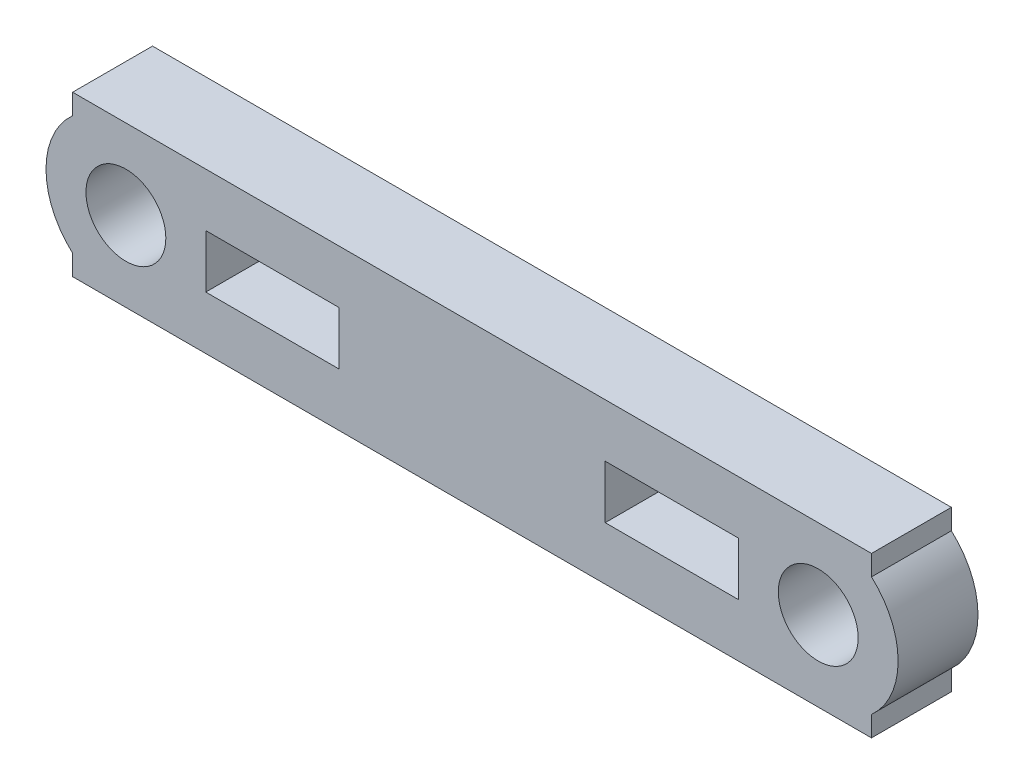
ISO-10303-21;
HEADER;
FILE_DESCRIPTION(('STEP AP214'),'2;1');
FILE_NAME('part.step','',(''),(''),'','','');
FILE_SCHEMA(('AUTOMOTIVE_DESIGN { 1 0 10303 214 1 1 1 1 }'));
ENDSEC;
DATA;
#1=APPLICATION_CONTEXT('core data for automotive mechanical design processes');
#2=APPLICATION_PROTOCOL_DEFINITION('international standard','automotive_design',2000,#1);
#3=PRODUCT_CONTEXT('',#1,'mechanical');
#4=PRODUCT('Part','Part','',(#3));
#5=PRODUCT_RELATED_PRODUCT_CATEGORY('part','',(#4));
#6=PRODUCT_DEFINITION_FORMATION('','',#4);
#7=PRODUCT_DEFINITION_CONTEXT('part definition',#1,'design');
#8=PRODUCT_DEFINITION('design','',#6,#7);
#9=PRODUCT_DEFINITION_SHAPE('','',#8);
#10=(LENGTH_UNIT() NAMED_UNIT(*) SI_UNIT(.MILLI.,.METRE.));
#11=(NAMED_UNIT(*) PLANE_ANGLE_UNIT() SI_UNIT($,.RADIAN.));
#12=(NAMED_UNIT(*) SI_UNIT($,.STERADIAN.) SOLID_ANGLE_UNIT());
#13=UNCERTAINTY_MEASURE_WITH_UNIT(LENGTH_MEASURE(1.E-05),#10,'distance_accuracy_value','');
#14=(GEOMETRIC_REPRESENTATION_CONTEXT(3) GLOBAL_UNCERTAINTY_ASSIGNED_CONTEXT((#13)) GLOBAL_UNIT_ASSIGNED_CONTEXT((#10,
#11,#12)) REPRESENTATION_CONTEXT('',''));
#15=CARTESIAN_POINT('',(0.,0.,0.));
#16=DIRECTION('',(0.,0.,1.));
#17=DIRECTION('',(1.,0.,0.));
#18=AXIS2_PLACEMENT_3D('',#15,#16,#17);
#19=CARTESIAN_POINT('',(-83.5597473967523,29.0911389026961,3.));
#20=DIRECTION('',(1.,0.,0.));
#21=DIRECTION('',(0.,0.,-1.));
#22=AXIS2_PLACEMENT_3D('',#19,#20,#21);
#23=PLANE('',#22);
#24=DIRECTION('',(0.,-1.,0.));
#25=VECTOR('',#24,1.);
#26=CARTESIAN_POINT('',(-83.5597473967523,29.0911389026961,0.));
#27=LINE('',#26,#25);
#28=CARTESIAN_POINT('',(-83.5597473967523,29.0911389026961,0.));
#29=VERTEX_POINT('',#28);
#30=CARTESIAN_POINT('',(-83.5597473967523,28.3272068801959,0.));
#31=VERTEX_POINT('',#30);
#32=EDGE_CURVE('E160',#29,#31,#27,.T.);
#33=ORIENTED_EDGE('',*,*,#32,.T.);
#34=DIRECTION('',(0.,0.,1.));
#35=VECTOR('',#34,1.);
#36=CARTESIAN_POINT('',(-83.5597473967523,28.3272068801959,0.));
#37=LINE('',#36,#35);
#38=CARTESIAN_POINT('',(-83.5597473967523,28.3272068801959,3.));
#39=VERTEX_POINT('',#38);
#40=EDGE_CURVE('E144',#31,#39,#37,.T.);
#41=ORIENTED_EDGE('',*,*,#40,.T.);
#42=DIRECTION('',(0.,-1.,0.));
#43=VECTOR('',#42,1.);
#44=CARTESIAN_POINT('',(-83.5597473967523,29.0911389026961,3.));
#45=LINE('',#44,#43);
#46=CARTESIAN_POINT('',(-83.5597473967523,29.0911389026961,3.));
#47=VERTEX_POINT('',#46);
#48=EDGE_CURVE('E277',#47,#39,#45,.T.);
#49=ORIENTED_EDGE('',*,*,#48,.F.);
#50=DIRECTION('',(0.,0.,-1.));
#51=VECTOR('',#50,1.);
#52=CARTESIAN_POINT('',(-83.5597473967523,29.0911389026961,3.));
#53=LINE('',#52,#51);
#54=EDGE_CURVE('E166',#47,#29,#53,.T.);
#55=ORIENTED_EDGE('',*,*,#54,.T.);
#56=EDGE_LOOP('',(#33,#41,#49,#55));
#57=FACE_BOUND('',#56,.T.);
#58=ADVANCED_FACE('F33',(#57),#23,.F.);
#59=CARTESIAN_POINT('',(-53.5597473967523,29.0911389026961,3.));
#60=DIRECTION('',(-1.,0.,0.));
#61=DIRECTION('',(0.,0.,1.));
#62=AXIS2_PLACEMENT_3D('',#59,#60,#61);
#63=PLANE('',#62);
#64=DIRECTION('',(0.,1.,0.));
#65=VECTOR('',#64,1.);
#66=CARTESIAN_POINT('',(-53.5597473967523,29.0911389026961,0.));
#67=LINE('',#66,#65);
#68=CARTESIAN_POINT('',(-53.5597473967523,23.0911389026961,0.));
#69=VERTEX_POINT('',#68);
#70=CARTESIAN_POINT('',(-53.5597473967523,23.8550709251964,0.));
#71=VERTEX_POINT('',#70);
#72=EDGE_CURVE('E176',#69,#71,#67,.T.);
#73=ORIENTED_EDGE('',*,*,#72,.T.);
#74=DIRECTION('',(0.,0.,1.));
#75=VECTOR('',#74,1.);
#76=CARTESIAN_POINT('',(-53.5597473967523,23.8550709251964,0.));
#77=LINE('',#76,#75);
#78=CARTESIAN_POINT('',(-53.5597473967523,23.8550709251964,3.));
#79=VERTEX_POINT('',#78);
#80=EDGE_CURVE('E200',#71,#79,#77,.T.);
#81=ORIENTED_EDGE('',*,*,#80,.T.);
#82=DIRECTION('',(0.,1.,0.));
#83=VECTOR('',#82,1.);
#84=CARTESIAN_POINT('',(-53.5597473967523,29.0911389026961,3.));
#85=LINE('',#84,#83);
#86=CARTESIAN_POINT('',(-53.5597473967523,23.0911389026961,3.));
#87=VERTEX_POINT('',#86);
#88=EDGE_CURVE('E192',#87,#79,#85,.T.);
#89=ORIENTED_EDGE('',*,*,#88,.F.);
#90=DIRECTION('',(0.,0.,-1.));
#91=VECTOR('',#90,1.);
#92=CARTESIAN_POINT('',(-53.5597473967523,23.0911389026961,3.));
#93=LINE('',#92,#91);
#94=EDGE_CURVE('E41',#87,#69,#93,.T.);
#95=ORIENTED_EDGE('',*,*,#94,.T.);
#96=EDGE_LOOP('',(#73,#81,#89,#95));
#97=FACE_BOUND('',#96,.T.);
#98=ADVANCED_FACE('F190',(#97),#63,.F.);
#99=CARTESIAN_POINT('',(0.,0.,3.));
#100=DIRECTION('',(0.,0.,1.));
#101=DIRECTION('',(1.,0.,0.));
#102=AXIS2_PLACEMENT_3D('',#99,#100,#101);
#103=PLANE('',#102);
#104=CARTESIAN_POINT('',(-81.5597473967523,26.0911389026961,3.));
#105=DIRECTION('',(0.,0.,1.));
#106=DIRECTION('',(1.,0.,0.));
#107=AXIS2_PLACEMENT_3D('',#104,#105,#106);
#108=CIRCLE('',#107,1.5);
#109=CARTESIAN_POINT('',(-80.0597473967523,26.0911389026961,3.));
#110=VERTEX_POINT('',#109);
#111=EDGE_CURVE('E215',#110,#110,#108,.T.);
#112=ORIENTED_EDGE('',*,*,#111,.F.);
#113=EDGE_LOOP('',(#112));
#114=FACE_BOUND('',#113,.T.);
#115=DIRECTION('',(0.,1.,0.));
#116=VECTOR('',#115,1.);
#117=CARTESIAN_POINT('',(-73.5597473967523,27.0911389026961,3.));
#118=LINE('',#117,#116);
#119=CARTESIAN_POINT('',(-73.5597473967523,25.0911389026961,3.));
#120=VERTEX_POINT('',#119);
#121=CARTESIAN_POINT('',(-73.5597473967523,27.0911389026961,3.));
#122=VERTEX_POINT('',#121);
#123=EDGE_CURVE('E255',#120,#122,#118,.T.);
#124=ORIENTED_EDGE('',*,*,#123,.F.);
#125=DIRECTION('',(1.,0.,0.));
#126=VECTOR('',#125,1.);
#127=CARTESIAN_POINT('',(-73.5597473967523,25.0911389026961,3.));
#128=LINE('',#127,#126);
#129=CARTESIAN_POINT('',(-78.5597473967523,25.0911389026961,3.));
#130=VERTEX_POINT('',#129);
#131=EDGE_CURVE('E252',#130,#120,#128,.T.);
#132=ORIENTED_EDGE('',*,*,#131,.F.);
#133=DIRECTION('',(0.,-1.,0.));
#134=VECTOR('',#133,1.);
#135=CARTESIAN_POINT('',(-78.5597473967523,25.0911389026961,3.));
#136=LINE('',#135,#134);
#137=CARTESIAN_POINT('',(-78.5597473967523,27.0911389026961,3.));
#138=VERTEX_POINT('',#137);
#139=EDGE_CURVE('E250',#138,#130,#136,.T.);
#140=ORIENTED_EDGE('',*,*,#139,.F.);
#141=DIRECTION('',(-1.,0.,0.));
#142=VECTOR('',#141,1.);
#143=CARTESIAN_POINT('',(-78.5597473967523,27.0911389026961,3.));
#144=LINE('',#143,#142);
#145=EDGE_CURVE('E257',#122,#138,#144,.T.);
#146=ORIENTED_EDGE('',*,*,#145,.F.);
#147=EDGE_LOOP('',(#124,#132,#140,#146));
#148=FACE_BOUND('',#147,.T.);
#149=ORIENTED_EDGE('',*,*,#48,.T.);
#150=CARTESIAN_POINT('',(-81.5597473967523,26.0911389026961,3.));
#151=DIRECTION('',(0.,0.,1.));
#152=DIRECTION('',(1.,0.,0.));
#153=AXIS2_PLACEMENT_3D('',#150,#151,#152);
#154=CIRCLE('',#153,2.99999999999999);
#155=CARTESIAN_POINT('',(-83.5597473967523,23.8550709251964,3.));
#156=VERTEX_POINT('',#155);
#157=EDGE_CURVE('E48',#39,#156,#154,.T.);
#158=ORIENTED_EDGE('',*,*,#157,.T.);
#159=CARTESIAN_POINT('',(-83.5597473967523,23.0911389026961,3.));
#160=VERTEX_POINT('',#159);
#161=EDGE_CURVE('E181',#156,#160,#45,.T.);
#162=ORIENTED_EDGE('',*,*,#161,.T.);
#163=DIRECTION('',(1.,0.,0.));
#164=VECTOR('',#163,1.);
#165=CARTESIAN_POINT('',(-83.5597473967523,23.0911389026961,3.));
#166=LINE('',#165,#164);
#167=EDGE_CURVE('E279',#160,#87,#166,.T.);
#168=ORIENTED_EDGE('',*,*,#167,.T.);
#169=ORIENTED_EDGE('',*,*,#88,.T.);
#170=CARTESIAN_POINT('',(-55.5597473967523,26.0911389026961,3.));
#171=DIRECTION('',(0.,0.,1.));
#172=DIRECTION('',(1.,0.,0.));
#173=AXIS2_PLACEMENT_3D('',#170,#171,#172);
#174=CIRCLE('',#173,3.);
#175=CARTESIAN_POINT('',(-53.5597473967523,28.3272068801959,3.));
#176=VERTEX_POINT('',#175);
#177=EDGE_CURVE('E55',#79,#176,#174,.T.);
#178=ORIENTED_EDGE('',*,*,#177,.T.);
#179=CARTESIAN_POINT('',(-53.5597473967523,29.0911389026961,3.));
#180=VERTEX_POINT('',#179);
#181=EDGE_CURVE('E280',#176,#180,#85,.T.);
#182=ORIENTED_EDGE('',*,*,#181,.T.);
#183=DIRECTION('',(-1.,0.,0.));
#184=VECTOR('',#183,1.);
#185=CARTESIAN_POINT('',(-83.5597473967523,29.0911389026961,3.));
#186=LINE('',#185,#184);
#187=EDGE_CURVE('E173',#180,#47,#186,.T.);
#188=ORIENTED_EDGE('',*,*,#187,.T.);
#189=EDGE_LOOP('',(#149,#158,#162,#168,#169,#178,#182,#188));
#190=FACE_BOUND('',#189,.T.);
#191=DIRECTION('',(0.,-1.,0.));
#192=VECTOR('',#191,1.);
#193=CARTESIAN_POINT('',(-63.5597473967523,25.0911389026961,3.));
#194=LINE('',#193,#192);
#195=CARTESIAN_POINT('',(-63.5597473967523,27.0911389026961,3.));
#196=VERTEX_POINT('',#195);
#197=CARTESIAN_POINT('',(-63.5597473967523,25.0911389026961,3.));
#198=VERTEX_POINT('',#197);
#199=EDGE_CURVE('E226',#196,#198,#194,.T.);
#200=ORIENTED_EDGE('',*,*,#199,.F.);
#201=DIRECTION('',(-1.,0.,0.));
#202=VECTOR('',#201,1.);
#203=CARTESIAN_POINT('',(-63.5597473967523,27.0911389026961,3.));
#204=LINE('',#203,#202);
#205=CARTESIAN_POINT('',(-58.5597473967523,27.0911389026961,3.));
#206=VERTEX_POINT('',#205);
#207=EDGE_CURVE('E223',#206,#196,#204,.T.);
#208=ORIENTED_EDGE('',*,*,#207,.F.);
#209=DIRECTION('',(0.,1.,0.));
#210=VECTOR('',#209,1.);
#211=CARTESIAN_POINT('',(-58.5597473967523,27.0911389026961,3.));
#212=LINE('',#211,#210);
#213=CARTESIAN_POINT('',(-58.5597473967523,25.0911389026961,3.));
#214=VERTEX_POINT('',#213);
#215=EDGE_CURVE('E221',#214,#206,#212,.T.);
#216=ORIENTED_EDGE('',*,*,#215,.F.);
#217=DIRECTION('',(1.,0.,0.));
#218=VECTOR('',#217,1.);
#219=CARTESIAN_POINT('',(-58.5597473967523,25.0911389026961,3.));
#220=LINE('',#219,#218);
#221=EDGE_CURVE('E228',#198,#214,#220,.T.);
#222=ORIENTED_EDGE('',*,*,#221,.F.);
#223=EDGE_LOOP('',(#200,#208,#216,#222));
#224=FACE_BOUND('',#223,.T.);
#225=CARTESIAN_POINT('',(-55.5597473967523,26.0911389026961,3.));
#226=DIRECTION('',(0.,0.,1.));
#227=DIRECTION('',(1.,0.,0.));
#228=AXIS2_PLACEMENT_3D('',#225,#226,#227);
#229=CIRCLE('',#228,1.5);
#230=CARTESIAN_POINT('',(-54.0597473967523,26.0911389026961,3.));
#231=VERTEX_POINT('',#230);
#232=EDGE_CURVE('E209',#231,#231,#229,.T.);
#233=ORIENTED_EDGE('',*,*,#232,.F.);
#234=EDGE_LOOP('',(#233));
#235=FACE_BOUND('',#234,.T.);
#236=ADVANCED_FACE('F283',(#114,#148,#190,#224,#235),#103,.T.);
#237=CARTESIAN_POINT('',(0.,0.,0.));
#238=DIRECTION('',(0.,0.,1.));
#239=DIRECTION('',(1.,0.,0.));
#240=AXIS2_PLACEMENT_3D('',#237,#238,#239);
#241=PLANE('',#240);
#242=CARTESIAN_POINT('',(-81.5597473967523,26.0911389026961,0.));
#243=DIRECTION('',(0.,0.,1.));
#244=DIRECTION('',(1.,0.,0.));
#245=AXIS2_PLACEMENT_3D('',#242,#243,#244);
#246=CIRCLE('',#245,1.5);
#247=CARTESIAN_POINT('',(-80.0597473967523,26.0911389026961,0.));
#248=VERTEX_POINT('',#247);
#249=EDGE_CURVE('E212',#248,#248,#246,.T.);
#250=ORIENTED_EDGE('',*,*,#249,.T.);
#251=EDGE_LOOP('',(#250));
#252=FACE_BOUND('',#251,.T.);
#253=DIRECTION('',(1.,0.,0.));
#254=VECTOR('',#253,1.);
#255=CARTESIAN_POINT('',(-73.5597473967523,25.0911389026961,0.));
#256=LINE('',#255,#254);
#257=CARTESIAN_POINT('',(-78.5597473967523,25.0911389026961,0.));
#258=VERTEX_POINT('',#257);
#259=CARTESIAN_POINT('',(-73.5597473967523,25.0911389026961,0.));
#260=VERTEX_POINT('',#259);
#261=EDGE_CURVE('E249',#258,#260,#256,.T.);
#262=ORIENTED_EDGE('',*,*,#261,.T.);
#263=DIRECTION('',(0.,1.,0.));
#264=VECTOR('',#263,1.);
#265=CARTESIAN_POINT('',(-73.5597473967523,27.0911389026961,0.));
#266=LINE('',#265,#264);
#267=CARTESIAN_POINT('',(-73.5597473967523,27.0911389026961,0.));
#268=VERTEX_POINT('',#267);
#269=EDGE_CURVE('E263',#260,#268,#266,.T.);
#270=ORIENTED_EDGE('',*,*,#269,.T.);
#271=DIRECTION('',(-1.,0.,0.));
#272=VECTOR('',#271,1.);
#273=CARTESIAN_POINT('',(-78.5597473967523,27.0911389026961,0.));
#274=LINE('',#273,#272);
#275=CARTESIAN_POINT('',(-78.5597473967523,27.0911389026961,0.));
#276=VERTEX_POINT('',#275);
#277=EDGE_CURVE('E266',#268,#276,#274,.T.);
#278=ORIENTED_EDGE('',*,*,#277,.T.);
#279=DIRECTION('',(0.,-1.,0.));
#280=VECTOR('',#279,1.);
#281=CARTESIAN_POINT('',(-78.5597473967523,26.0911389026961,0.));
#282=LINE('',#281,#280);
#283=EDGE_CURVE('E253',#276,#258,#282,.T.);
#284=ORIENTED_EDGE('',*,*,#283,.T.);
#285=EDGE_LOOP('',(#262,#270,#278,#284));
#286=FACE_BOUND('',#285,.T.);
#287=ORIENTED_EDGE('',*,*,#32,.F.);
#288=DIRECTION('',(-1.,0.,0.));
#289=VECTOR('',#288,1.);
#290=CARTESIAN_POINT('',(-83.5597473967523,29.0911389026961,0.));
#291=LINE('',#290,#289);
#292=CARTESIAN_POINT('',(-53.5597473967523,29.0911389026961,0.));
#293=VERTEX_POINT('',#292);
#294=EDGE_CURVE('E179',#293,#29,#291,.T.);
#295=ORIENTED_EDGE('',*,*,#294,.F.);
#296=CARTESIAN_POINT('',(-53.5597473967523,28.3272068801959,0.));
#297=VERTEX_POINT('',#296);
#298=EDGE_CURVE('E169',#297,#293,#67,.T.);
#299=ORIENTED_EDGE('',*,*,#298,.F.);
#300=CARTESIAN_POINT('',(-55.5597473967523,26.0911389026961,0.));
#301=DIRECTION('',(0.,0.,1.));
#302=DIRECTION('',(1.,0.,0.));
#303=AXIS2_PLACEMENT_3D('',#300,#301,#302);
#304=CIRCLE('',#303,3.);
#305=EDGE_CURVE('E197',#71,#297,#304,.T.);
#306=ORIENTED_EDGE('',*,*,#305,.F.);
#307=ORIENTED_EDGE('',*,*,#72,.F.);
#308=DIRECTION('',(1.,0.,0.));
#309=VECTOR('',#308,1.);
#310=CARTESIAN_POINT('',(-83.5597473967523,23.0911389026961,0.));
#311=LINE('',#310,#309);
#312=CARTESIAN_POINT('',(-83.5597473967523,23.0911389026961,0.));
#313=VERTEX_POINT('',#312);
#314=EDGE_CURVE('E167',#313,#69,#311,.T.);
#315=ORIENTED_EDGE('',*,*,#314,.F.);
#316=CARTESIAN_POINT('',(-83.5597473967523,23.8550709251964,0.));
#317=VERTEX_POINT('',#316);
#318=EDGE_CURVE('E162',#317,#313,#27,.T.);
#319=ORIENTED_EDGE('',*,*,#318,.F.);
#320=CARTESIAN_POINT('',(-81.5597473967523,26.0911389026961,0.));
#321=DIRECTION('',(0.,0.,1.));
#322=DIRECTION('',(1.,0.,0.));
#323=AXIS2_PLACEMENT_3D('',#320,#321,#322);
#324=CIRCLE('',#323,2.99999999999999);
#325=EDGE_CURVE('E147',#31,#317,#324,.T.);
#326=ORIENTED_EDGE('',*,*,#325,.F.);
#327=EDGE_LOOP('',(#287,#295,#299,#306,#307,#315,#319,#326));
#328=FACE_BOUND('',#327,.T.);
#329=DIRECTION('',(-1.,0.,0.));
#330=VECTOR('',#329,1.);
#331=CARTESIAN_POINT('',(-63.5597473967523,27.0911389026961,0.));
#332=LINE('',#331,#330);
#333=CARTESIAN_POINT('',(-58.5597473967523,27.0911389026961,0.));
#334=VERTEX_POINT('',#333);
#335=CARTESIAN_POINT('',(-63.5597473967523,27.0911389026961,0.));
#336=VERTEX_POINT('',#335);
#337=EDGE_CURVE('E218',#334,#336,#332,.T.);
#338=ORIENTED_EDGE('',*,*,#337,.T.);
#339=DIRECTION('',(0.,-1.,0.));
#340=VECTOR('',#339,1.);
#341=CARTESIAN_POINT('',(-63.5597473967523,25.0911389026961,0.));
#342=LINE('',#341,#340);
#343=CARTESIAN_POINT('',(-63.5597473967523,25.0911389026961,0.));
#344=VERTEX_POINT('',#343);
#345=EDGE_CURVE('E234',#336,#344,#342,.T.);
#346=ORIENTED_EDGE('',*,*,#345,.T.);
#347=DIRECTION('',(1.,0.,0.));
#348=VECTOR('',#347,1.);
#349=CARTESIAN_POINT('',(-58.5597473967523,25.0911389026961,0.));
#350=LINE('',#349,#348);
#351=CARTESIAN_POINT('',(-58.5597473967523,25.0911389026961,0.));
#352=VERTEX_POINT('',#351);
#353=EDGE_CURVE('E237',#344,#352,#350,.T.);
#354=ORIENTED_EDGE('',*,*,#353,.T.);
#355=DIRECTION('',(0.,1.,0.));
#356=VECTOR('',#355,1.);
#357=CARTESIAN_POINT('',(-58.5597473967523,26.0911389026961,0.));
#358=LINE('',#357,#356);
#359=EDGE_CURVE('E224',#352,#334,#358,.T.);
#360=ORIENTED_EDGE('',*,*,#359,.T.);
#361=EDGE_LOOP('',(#338,#346,#354,#360));
#362=FACE_BOUND('',#361,.T.);
#363=CARTESIAN_POINT('',(-55.5597473967523,26.0911389026961,0.));
#364=DIRECTION('',(0.,0.,1.));
#365=DIRECTION('',(1.,0.,0.));
#366=AXIS2_PLACEMENT_3D('',#363,#364,#365);
#367=CIRCLE('',#366,1.5);
#368=CARTESIAN_POINT('',(-54.0597473967523,26.0911389026961,0.));
#369=VERTEX_POINT('',#368);
#370=EDGE_CURVE('E207',#369,#369,#367,.T.);
#371=ORIENTED_EDGE('',*,*,#370,.T.);
#372=EDGE_LOOP('',(#371));
#373=FACE_BOUND('',#372,.T.);
#374=ADVANCED_FACE('F157',(#252,#286,#328,#362,#373),#241,.F.);
#375=ORIENTED_EDGE('',*,*,#161,.F.);
#376=DIRECTION('',(0.,0.,1.));
#377=VECTOR('',#376,1.);
#378=CARTESIAN_POINT('',(-83.5597473967523,23.8550709251964,0.));
#379=LINE('',#378,#377);
#380=EDGE_CURVE('E152',#317,#156,#379,.T.);
#381=ORIENTED_EDGE('',*,*,#380,.F.);
#382=ORIENTED_EDGE('',*,*,#318,.T.);
#383=DIRECTION('',(0.,0.,-1.));
#384=VECTOR('',#383,1.);
#385=CARTESIAN_POINT('',(-83.5597473967523,23.0911389026961,3.));
#386=LINE('',#385,#384);
#387=EDGE_CURVE('E11',#160,#313,#386,.T.);
#388=ORIENTED_EDGE('',*,*,#387,.F.);
#389=EDGE_LOOP('',(#375,#381,#382,#388));
#390=FACE_BOUND('',#389,.T.);
#391=ADVANCED_FACE('F35',(#390),#23,.F.);
#392=CARTESIAN_POINT('',(-83.5597473967523,23.0911389026961,3.));
#393=DIRECTION('',(0.,1.,0.));
#394=DIRECTION('',(0.,0.,1.));
#395=AXIS2_PLACEMENT_3D('',#392,#393,#394);
#396=PLANE('',#395);
#397=ORIENTED_EDGE('',*,*,#314,.T.);
#398=ORIENTED_EDGE('',*,*,#94,.F.);
#399=ORIENTED_EDGE('',*,*,#167,.F.);
#400=ORIENTED_EDGE('',*,*,#387,.T.);
#401=EDGE_LOOP('',(#397,#398,#399,#400));
#402=FACE_BOUND('',#401,.T.);
#403=ADVANCED_FACE('F300',(#402),#396,.F.);
#404=ORIENTED_EDGE('',*,*,#181,.F.);
#405=DIRECTION('',(0.,0.,1.));
#406=VECTOR('',#405,1.);
#407=CARTESIAN_POINT('',(-53.5597473967523,28.3272068801959,0.));
#408=LINE('',#407,#406);
#409=EDGE_CURVE('E202',#297,#176,#408,.T.);
#410=ORIENTED_EDGE('',*,*,#409,.F.);
#411=ORIENTED_EDGE('',*,*,#298,.T.);
#412=DIRECTION('',(0.,0.,-1.));
#413=VECTOR('',#412,1.);
#414=CARTESIAN_POINT('',(-53.5597473967523,29.0911389026961,3.));
#415=LINE('',#414,#413);
#416=EDGE_CURVE('E183',#180,#293,#415,.T.);
#417=ORIENTED_EDGE('',*,*,#416,.F.);
#418=EDGE_LOOP('',(#404,#410,#411,#417));
#419=FACE_BOUND('',#418,.T.);
#420=ADVANCED_FACE('F287',(#419),#63,.F.);
#421=CARTESIAN_POINT('',(-83.5597473967523,29.0911389026961,3.));
#422=DIRECTION('',(0.,-1.,0.));
#423=DIRECTION('',(0.,0.,-1.));
#424=AXIS2_PLACEMENT_3D('',#421,#422,#423);
#425=PLANE('',#424);
#426=ORIENTED_EDGE('',*,*,#294,.T.);
#427=ORIENTED_EDGE('',*,*,#54,.F.);
#428=ORIENTED_EDGE('',*,*,#187,.F.);
#429=ORIENTED_EDGE('',*,*,#416,.T.);
#430=EDGE_LOOP('',(#426,#427,#428,#429));
#431=FACE_BOUND('',#430,.T.);
#432=ADVANCED_FACE('F289',(#431),#425,.F.);
#433=CARTESIAN_POINT('',(-73.5597473967523,25.0911389026961,3.));
#434=DIRECTION('',(0.,1.,0.));
#435=DIRECTION('',(0.,0.,1.));
#436=AXIS2_PLACEMENT_3D('',#433,#434,#435);
#437=PLANE('',#436);
#438=ORIENTED_EDGE('',*,*,#261,.F.);
#439=DIRECTION('',(0.,0.,-1.));
#440=VECTOR('',#439,1.);
#441=CARTESIAN_POINT('',(-78.5597473967523,25.0911389026961,3.));
#442=LINE('',#441,#440);
#443=EDGE_CURVE('E171',#130,#258,#442,.T.);
#444=ORIENTED_EDGE('',*,*,#443,.F.);
#445=ORIENTED_EDGE('',*,*,#131,.T.);
#446=DIRECTION('',(0.,0.,-1.));
#447=VECTOR('',#446,1.);
#448=CARTESIAN_POINT('',(-73.5597473967523,25.0911389026961,3.));
#449=LINE('',#448,#447);
#450=EDGE_CURVE('E274',#120,#260,#449,.T.);
#451=ORIENTED_EDGE('',*,*,#450,.T.);
#452=EDGE_LOOP('',(#438,#444,#445,#451));
#453=FACE_BOUND('',#452,.T.);
#454=ADVANCED_FACE('F291',(#453),#437,.T.);
#455=CARTESIAN_POINT('',(-73.5597473967523,27.0911389026961,3.));
#456=DIRECTION('',(-1.,0.,0.));
#457=DIRECTION('',(0.,0.,1.));
#458=AXIS2_PLACEMENT_3D('',#455,#456,#457);
#459=PLANE('',#458);
#460=ORIENTED_EDGE('',*,*,#269,.F.);
#461=ORIENTED_EDGE('',*,*,#450,.F.);
#462=ORIENTED_EDGE('',*,*,#123,.T.);
#463=DIRECTION('',(0.,0.,-1.));
#464=VECTOR('',#463,1.);
#465=CARTESIAN_POINT('',(-73.5597473967523,27.0911389026961,3.));
#466=LINE('',#465,#464);
#467=EDGE_CURVE('E272',#122,#268,#466,.T.);
#468=ORIENTED_EDGE('',*,*,#467,.T.);
#469=EDGE_LOOP('',(#460,#461,#462,#468));
#470=FACE_BOUND('',#469,.T.);
#471=ADVANCED_FACE('F297',(#470),#459,.T.);
#472=CARTESIAN_POINT('',(-78.5597473967523,27.0911389026961,3.));
#473=DIRECTION('',(0.,-1.,0.));
#474=DIRECTION('',(0.,0.,-1.));
#475=AXIS2_PLACEMENT_3D('',#472,#473,#474);
#476=PLANE('',#475);
#477=ORIENTED_EDGE('',*,*,#277,.F.);
#478=ORIENTED_EDGE('',*,*,#467,.F.);
#479=ORIENTED_EDGE('',*,*,#145,.T.);
#480=DIRECTION('',(0.,0.,-1.));
#481=VECTOR('',#480,1.);
#482=CARTESIAN_POINT('',(-78.5597473967523,27.0911389026961,3.));
#483=LINE('',#482,#481);
#484=EDGE_CURVE('E260',#138,#276,#483,.T.);
#485=ORIENTED_EDGE('',*,*,#484,.T.);
#486=EDGE_LOOP('',(#477,#478,#479,#485));
#487=FACE_BOUND('',#486,.T.);
#488=ADVANCED_FACE('F326',(#487),#476,.T.);
#489=CARTESIAN_POINT('',(-78.5597473967523,26.0911389026961,3.));
#490=DIRECTION('',(1.,0.,0.));
#491=DIRECTION('',(0.,0.,-1.));
#492=AXIS2_PLACEMENT_3D('',#489,#490,#491);
#493=PLANE('',#492);
#494=ORIENTED_EDGE('',*,*,#283,.F.);
#495=ORIENTED_EDGE('',*,*,#484,.F.);
#496=ORIENTED_EDGE('',*,*,#139,.T.);
#497=ORIENTED_EDGE('',*,*,#443,.T.);
#498=EDGE_LOOP('',(#494,#495,#496,#497));
#499=FACE_BOUND('',#498,.T.);
#500=ADVANCED_FACE('F330',(#499),#493,.T.);
#501=CARTESIAN_POINT('',(-63.5597473967523,27.0911389026961,3.));
#502=DIRECTION('',(0.,-1.,0.));
#503=DIRECTION('',(0.,0.,-1.));
#504=AXIS2_PLACEMENT_3D('',#501,#502,#503);
#505=PLANE('',#504);
#506=ORIENTED_EDGE('',*,*,#337,.F.);
#507=DIRECTION('',(0.,0.,-1.));
#508=VECTOR('',#507,1.);
#509=CARTESIAN_POINT('',(-58.5597473967523,27.0911389026961,3.));
#510=LINE('',#509,#508);
#511=EDGE_CURVE('E247',#206,#334,#510,.T.);
#512=ORIENTED_EDGE('',*,*,#511,.F.);
#513=ORIENTED_EDGE('',*,*,#207,.T.);
#514=DIRECTION('',(0.,0.,-1.));
#515=VECTOR('',#514,1.);
#516=CARTESIAN_POINT('',(-63.5597473967523,27.0911389026961,3.));
#517=LINE('',#516,#515);
#518=EDGE_CURVE('E245',#196,#336,#517,.T.);
#519=ORIENTED_EDGE('',*,*,#518,.T.);
#520=EDGE_LOOP('',(#506,#512,#513,#519));
#521=FACE_BOUND('',#520,.T.);
#522=ADVANCED_FACE('F334',(#521),#505,.T.);
#523=CARTESIAN_POINT('',(-63.5597473967523,25.0911389026961,3.));
#524=DIRECTION('',(1.,0.,0.));
#525=DIRECTION('',(0.,0.,-1.));
#526=AXIS2_PLACEMENT_3D('',#523,#524,#525);
#527=PLANE('',#526);
#528=ORIENTED_EDGE('',*,*,#345,.F.);
#529=ORIENTED_EDGE('',*,*,#518,.F.);
#530=ORIENTED_EDGE('',*,*,#199,.T.);
#531=DIRECTION('',(0.,0.,-1.));
#532=VECTOR('',#531,1.);
#533=CARTESIAN_POINT('',(-63.5597473967523,25.0911389026961,3.));
#534=LINE('',#533,#532);
#535=EDGE_CURVE('E243',#198,#344,#534,.T.);
#536=ORIENTED_EDGE('',*,*,#535,.T.);
#537=EDGE_LOOP('',(#528,#529,#530,#536));
#538=FACE_BOUND('',#537,.T.);
#539=ADVANCED_FACE('F338',(#538),#527,.T.);
#540=CARTESIAN_POINT('',(-58.5597473967523,25.0911389026961,3.));
#541=DIRECTION('',(0.,1.,0.));
#542=DIRECTION('',(0.,0.,1.));
#543=AXIS2_PLACEMENT_3D('',#540,#541,#542);
#544=PLANE('',#543);
#545=ORIENTED_EDGE('',*,*,#353,.F.);
#546=ORIENTED_EDGE('',*,*,#535,.F.);
#547=ORIENTED_EDGE('',*,*,#221,.T.);
#548=DIRECTION('',(0.,0.,-1.));
#549=VECTOR('',#548,1.);
#550=CARTESIAN_POINT('',(-58.5597473967523,25.0911389026961,3.));
#551=LINE('',#550,#549);
#552=EDGE_CURVE('E231',#214,#352,#551,.T.);
#553=ORIENTED_EDGE('',*,*,#552,.T.);
#554=EDGE_LOOP('',(#545,#546,#547,#553));
#555=FACE_BOUND('',#554,.T.);
#556=ADVANCED_FACE('F342',(#555),#544,.T.);
#557=CARTESIAN_POINT('',(-58.5597473967523,26.0911389026961,3.));
#558=DIRECTION('',(-1.,0.,0.));
#559=DIRECTION('',(0.,0.,1.));
#560=AXIS2_PLACEMENT_3D('',#557,#558,#559);
#561=PLANE('',#560);
#562=ORIENTED_EDGE('',*,*,#359,.F.);
#563=ORIENTED_EDGE('',*,*,#552,.F.);
#564=ORIENTED_EDGE('',*,*,#215,.T.);
#565=ORIENTED_EDGE('',*,*,#511,.T.);
#566=EDGE_LOOP('',(#562,#563,#564,#565));
#567=FACE_BOUND('',#566,.T.);
#568=ADVANCED_FACE('F346',(#567),#561,.T.);
#569=CARTESIAN_POINT('',(-81.5597473967523,26.0911389026961,3.));
#570=DIRECTION('',(0.,0.,-1.));
#571=DIRECTION('',(-1.,0.,0.));
#572=AXIS2_PLACEMENT_3D('',#569,#570,#571);
#573=CYLINDRICAL_SURFACE('',#572,1.5);
#574=ORIENTED_EDGE('',*,*,#111,.T.);
#575=EDGE_LOOP('',(#574));
#576=FACE_BOUND('',#575,.T.);
#577=ORIENTED_EDGE('',*,*,#249,.F.);
#578=EDGE_LOOP('',(#577));
#579=FACE_BOUND('',#578,.T.);
#580=ADVANCED_FACE('F350',(#576,#579),#573,.F.);
#581=CARTESIAN_POINT('',(-55.5597473967523,26.0911389026961,3.));
#582=DIRECTION('',(0.,0.,-1.));
#583=DIRECTION('',(-1.,0.,0.));
#584=AXIS2_PLACEMENT_3D('',#581,#582,#583);
#585=CYLINDRICAL_SURFACE('',#584,1.5);
#586=ORIENTED_EDGE('',*,*,#232,.T.);
#587=EDGE_LOOP('',(#586));
#588=FACE_BOUND('',#587,.T.);
#589=ORIENTED_EDGE('',*,*,#370,.F.);
#590=EDGE_LOOP('',(#589));
#591=FACE_BOUND('',#590,.T.);
#592=ADVANCED_FACE('F354',(#588,#591),#585,.F.);
#593=CARTESIAN_POINT('',(-55.5597473967523,26.0911389026961,0.));
#594=DIRECTION('',(0.,0.,1.));
#595=DIRECTION('',(1.,0.,0.));
#596=AXIS2_PLACEMENT_3D('',#593,#594,#595);
#597=CYLINDRICAL_SURFACE('',#596,3.);
#598=ORIENTED_EDGE('',*,*,#177,.F.);
#599=ORIENTED_EDGE('',*,*,#80,.F.);
#600=ORIENTED_EDGE('',*,*,#305,.T.);
#601=ORIENTED_EDGE('',*,*,#409,.T.);
#602=EDGE_LOOP('',(#598,#599,#600,#601));
#603=FACE_BOUND('',#602,.T.);
#604=ADVANCED_FACE('F358',(#603),#597,.T.);
#605=CARTESIAN_POINT('',(-81.5597473967523,26.0911389026961,0.));
#606=DIRECTION('',(0.,0.,1.));
#607=DIRECTION('',(1.,0.,0.));
#608=AXIS2_PLACEMENT_3D('',#605,#606,#607);
#609=CYLINDRICAL_SURFACE('',#608,2.99999999999999);
#610=ORIENTED_EDGE('',*,*,#157,.F.);
#611=ORIENTED_EDGE('',*,*,#40,.F.);
#612=ORIENTED_EDGE('',*,*,#325,.T.);
#613=ORIENTED_EDGE('',*,*,#380,.T.);
#614=EDGE_LOOP('',(#610,#611,#612,#613));
#615=FACE_BOUND('',#614,.T.);
#616=ADVANCED_FACE('F146',(#615),#609,.T.);
#617=CLOSED_SHELL('',(#58,#98,#236,#374,#391,#403,#420,#432,#454,#471,#488,#500,#522,#539,#556,
#568,#580,#592,#604,#616));
#618=MANIFOLD_SOLID_BREP('B2',#617);
#619=ADVANCED_BREP_SHAPE_REPRESENTATION('',(#18,#618),#14);
#620=SHAPE_DEFINITION_REPRESENTATION(#9,#619);
ENDSEC;
END-ISO-10303-21;
